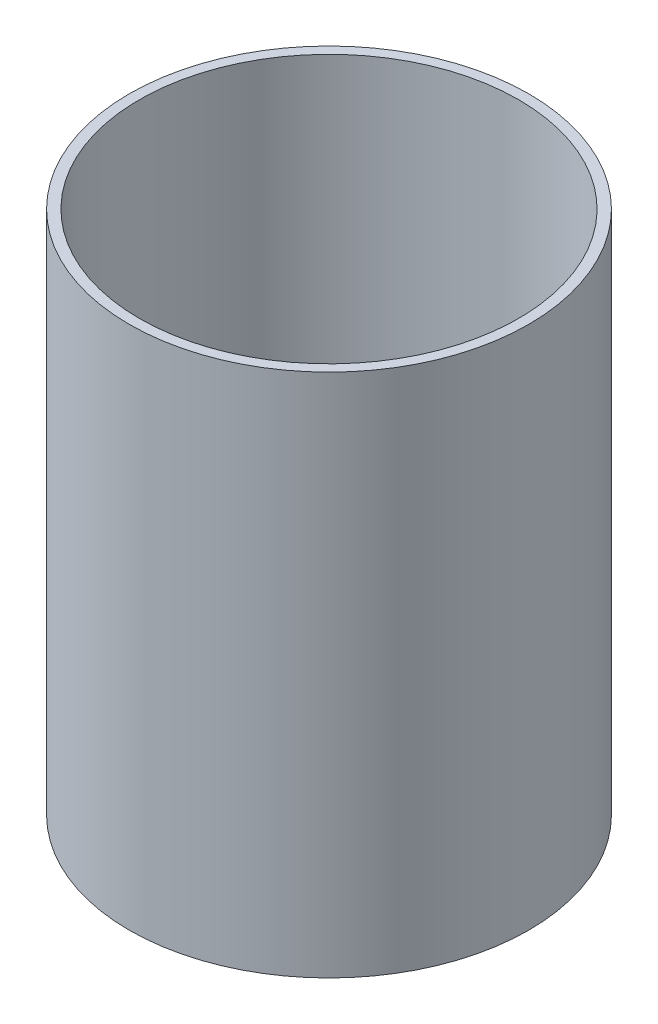
ISO-10303-21;
HEADER;
FILE_DESCRIPTION(('STEP AP214'),'2;1');
FILE_NAME('part.step','',(''),(''),'','','');
FILE_SCHEMA(('AUTOMOTIVE_DESIGN { 1 0 10303 214 1 1 1 1 }'));
ENDSEC;
DATA;
#1=APPLICATION_CONTEXT('core data for automotive mechanical design processes');
#2=APPLICATION_PROTOCOL_DEFINITION('international standard','automotive_design',2000,#1);
#3=PRODUCT_CONTEXT('',#1,'mechanical');
#4=PRODUCT('Part','Part','',(#3));
#5=PRODUCT_RELATED_PRODUCT_CATEGORY('part','',(#4));
#6=PRODUCT_DEFINITION_FORMATION('','',#4);
#7=PRODUCT_DEFINITION_CONTEXT('part definition',#1,'design');
#8=PRODUCT_DEFINITION('design','',#6,#7);
#9=PRODUCT_DEFINITION_SHAPE('','',#8);
#10=(LENGTH_UNIT() NAMED_UNIT(*) SI_UNIT(.MILLI.,.METRE.));
#11=(NAMED_UNIT(*) PLANE_ANGLE_UNIT() SI_UNIT($,.RADIAN.));
#12=(NAMED_UNIT(*) SI_UNIT($,.STERADIAN.) SOLID_ANGLE_UNIT());
#13=UNCERTAINTY_MEASURE_WITH_UNIT(LENGTH_MEASURE(1.E-05),#10,'distance_accuracy_value','');
#14=(GEOMETRIC_REPRESENTATION_CONTEXT(3) GLOBAL_UNCERTAINTY_ASSIGNED_CONTEXT((#13)) GLOBAL_UNIT_ASSIGNED_CONTEXT((#10,
#11,#12)) REPRESENTATION_CONTEXT('',''));
#15=CARTESIAN_POINT('',(0.,0.,0.));
#16=DIRECTION('',(0.,0.,1.));
#17=DIRECTION('',(1.,0.,0.));
#18=AXIS2_PLACEMENT_3D('',#15,#16,#17);
#19=CARTESIAN_POINT('',(0.,155.,0.));
#20=DIRECTION('',(0.,1.,0.));
#21=DIRECTION('',(0.,0.,1.));
#22=AXIS2_PLACEMENT_3D('',#19,#20,#21);
#23=PLANE('',#22);
#24=CARTESIAN_POINT('',(0.,155.,0.));
#25=DIRECTION('',(0.,1.,0.));
#26=DIRECTION('',(0.,0.,1.));
#27=AXIS2_PLACEMENT_3D('',#24,#25,#26);
#28=CIRCLE('',#27,59.);
#29=CARTESIAN_POINT('',(0.,155.,59.));
#30=VERTEX_POINT('',#29);
#31=EDGE_CURVE('E10',#30,#30,#28,.T.);
#32=ORIENTED_EDGE('',*,*,#31,.T.);
#33=EDGE_LOOP('',(#32));
#34=FACE_BOUND('',#33,.T.);
#35=CARTESIAN_POINT('',(0.,155.,0.));
#36=DIRECTION('',(0.,1.,0.));
#37=DIRECTION('',(0.,0.,1.));
#38=AXIS2_PLACEMENT_3D('',#35,#36,#37);
#39=CIRCLE('',#38,56.);
#40=CARTESIAN_POINT('',(0.,155.,56.));
#41=VERTEX_POINT('',#40);
#42=EDGE_CURVE('E50',#41,#41,#39,.T.);
#43=ORIENTED_EDGE('',*,*,#42,.F.);
#44=EDGE_LOOP('',(#43));
#45=FACE_BOUND('',#44,.T.);
#46=ADVANCED_FACE('F37',(#34,#45),#23,.T.);
#47=CARTESIAN_POINT('',(0.,0.,0.));
#48=DIRECTION('',(0.,1.,0.));
#49=DIRECTION('',(0.,0.,1.));
#50=AXIS2_PLACEMENT_3D('',#47,#48,#49);
#51=PLANE('',#50);
#52=CARTESIAN_POINT('',(0.,0.,0.));
#53=DIRECTION('',(0.,1.,0.));
#54=DIRECTION('',(0.,0.,1.));
#55=AXIS2_PLACEMENT_3D('',#52,#53,#54);
#56=CIRCLE('',#55,59.);
#57=CARTESIAN_POINT('',(0.,0.,59.));
#58=VERTEX_POINT('',#57);
#59=EDGE_CURVE('E41',#58,#58,#56,.T.);
#60=ORIENTED_EDGE('',*,*,#59,.F.);
#61=EDGE_LOOP('',(#60));
#62=FACE_BOUND('',#61,.T.);
#63=CARTESIAN_POINT('',(0.,0.,0.));
#64=DIRECTION('',(0.,1.,0.));
#65=DIRECTION('',(0.,0.,1.));
#66=AXIS2_PLACEMENT_3D('',#63,#64,#65);
#67=CIRCLE('',#66,56.);
#68=CARTESIAN_POINT('',(0.,0.,56.));
#69=VERTEX_POINT('',#68);
#70=EDGE_CURVE('E52',#69,#69,#67,.T.);
#71=ORIENTED_EDGE('',*,*,#70,.T.);
#72=EDGE_LOOP('',(#71));
#73=FACE_BOUND('',#72,.T.);
#74=ADVANCED_FACE('F64',(#62,#73),#51,.F.);
#75=CARTESIAN_POINT('',(0.,155.,0.));
#76=DIRECTION('',(0.,-1.,0.));
#77=DIRECTION('',(0.,0.,-1.));
#78=AXIS2_PLACEMENT_3D('',#75,#76,#77);
#79=CYLINDRICAL_SURFACE('',#78,59.);
#80=ORIENTED_EDGE('',*,*,#31,.F.);
#81=EDGE_LOOP('',(#80));
#82=FACE_BOUND('',#81,.T.);
#83=ORIENTED_EDGE('',*,*,#59,.T.);
#84=EDGE_LOOP('',(#83));
#85=FACE_BOUND('',#84,.T.);
#86=ADVANCED_FACE('F39',(#82,#85),#79,.T.);
#87=CARTESIAN_POINT('',(0.,155.,0.));
#88=DIRECTION('',(0.,-1.,0.));
#89=DIRECTION('',(0.,0.,-1.));
#90=AXIS2_PLACEMENT_3D('',#87,#88,#89);
#91=CYLINDRICAL_SURFACE('',#90,56.);
#92=ORIENTED_EDGE('',*,*,#42,.T.);
#93=EDGE_LOOP('',(#92));
#94=FACE_BOUND('',#93,.T.);
#95=ORIENTED_EDGE('',*,*,#70,.F.);
#96=EDGE_LOOP('',(#95));
#97=FACE_BOUND('',#96,.T.);
#98=ADVANCED_FACE('F60',(#94,#97),#91,.F.);
#99=CLOSED_SHELL('',(#46,#74,#86,#98));
#100=MANIFOLD_SOLID_BREP('B2',#99);
#101=ADVANCED_BREP_SHAPE_REPRESENTATION('',(#18,#100),#14);
#102=SHAPE_DEFINITION_REPRESENTATION(#9,#101);
ENDSEC;
END-ISO-10303-21;
